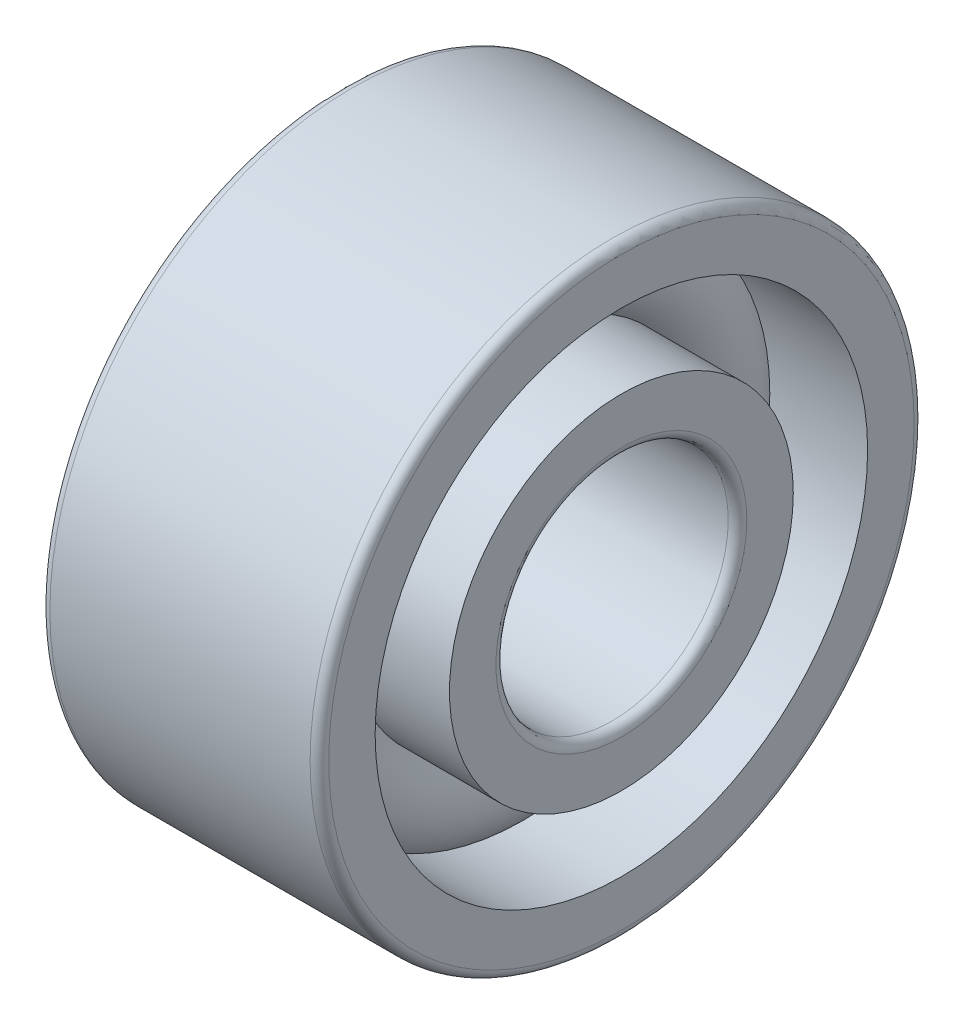
ISO-10303-21;
HEADER;
FILE_DESCRIPTION(('STEP AP214'),'2;1');
FILE_NAME('part.step','',(''),(''),'','','');
FILE_SCHEMA(('AUTOMOTIVE_DESIGN { 1 0 10303 214 1 1 1 1 }'));
ENDSEC;
DATA;
#1=APPLICATION_CONTEXT('core data for automotive mechanical design processes');
#2=APPLICATION_PROTOCOL_DEFINITION('international standard','automotive_design',2000,#1);
#3=PRODUCT_CONTEXT('',#1,'mechanical');
#4=PRODUCT('Part','Part','',(#3));
#5=PRODUCT_RELATED_PRODUCT_CATEGORY('part','',(#4));
#6=PRODUCT_DEFINITION_FORMATION('','',#4);
#7=PRODUCT_DEFINITION_CONTEXT('part definition',#1,'design');
#8=PRODUCT_DEFINITION('design','',#6,#7);
#9=PRODUCT_DEFINITION_SHAPE('','',#8);
#10=(LENGTH_UNIT() NAMED_UNIT(*) SI_UNIT(.MILLI.,.METRE.));
#11=(NAMED_UNIT(*) PLANE_ANGLE_UNIT() SI_UNIT($,.RADIAN.));
#12=(NAMED_UNIT(*) SI_UNIT($,.STERADIAN.) SOLID_ANGLE_UNIT());
#13=UNCERTAINTY_MEASURE_WITH_UNIT(LENGTH_MEASURE(1.E-05),#10,'distance_accuracy_value','');
#14=(GEOMETRIC_REPRESENTATION_CONTEXT(3) GLOBAL_UNCERTAINTY_ASSIGNED_CONTEXT((#13)) GLOBAL_UNIT_ASSIGNED_CONTEXT((#10,
#11,#12)) REPRESENTATION_CONTEXT('',''));
#15=CARTESIAN_POINT('',(0.,0.,0.));
#16=DIRECTION('',(0.,0.,1.));
#17=DIRECTION('',(1.,0.,0.));
#18=AXIS2_PLACEMENT_3D('',#15,#16,#17);
#19=CARTESIAN_POINT('',(0.,0.,0.));
#20=DIRECTION('',(-1.,0.,0.));
#21=DIRECTION('',(0.,0.,1.));
#22=AXIS2_PLACEMENT_3D('',#19,#20,#21);
#23=TOROIDAL_SURFACE('',#22,4.5,1.2);
#24=CARTESIAN_POINT('',(0.894427190999911,0.,0.));
#25=DIRECTION('',(-1.,0.,0.));
#26=DIRECTION('',(0.,0.,1.));
#27=AXIS2_PLACEMENT_3D('',#24,#25,#26);
#28=CIRCLE('',#27,5.30000000000001);
#29=CARTESIAN_POINT('',(0.894427190999911,0.,5.30000000000001));
#30=VERTEX_POINT('',#29);
#31=EDGE_CURVE('E35',#30,#30,#28,.F.);
#32=ORIENTED_EDGE('',*,*,#31,.T.);
#33=EDGE_LOOP('',(#32));
#34=FACE_BOUND('',#33,.T.);
#35=CARTESIAN_POINT('',(0.894427190999916,0.,0.));
#36=DIRECTION('',(-1.,0.,0.));
#37=DIRECTION('',(0.,0.,1.));
#38=AXIS2_PLACEMENT_3D('',#35,#36,#37);
#39=CIRCLE('',#38,3.7);
#40=CARTESIAN_POINT('',(0.894427190999916,0.,3.7));
#41=VERTEX_POINT('',#40);
#42=EDGE_CURVE('E10',#41,#41,#39,.T.);
#43=ORIENTED_EDGE('',*,*,#42,.T.);
#44=EDGE_LOOP('',(#43));
#45=FACE_BOUND('',#44,.T.);
#46=ADVANCED_FACE('F31',(#34,#45),#23,.T.);
#47=CARTESIAN_POINT('',(-20.6375,0.,0.));
#48=DIRECTION('',(1.,0.,0.));
#49=DIRECTION('',(0.,0.,-1.));
#50=AXIS2_PLACEMENT_3D('',#47,#48,#49);
#51=CYLINDRICAL_SURFACE('',#50,3.7);
#52=CARTESIAN_POINT('',(3.,0.,0.));
#53=DIRECTION('',(1.,0.,0.));
#54=DIRECTION('',(0.,0.,-1.));
#55=AXIS2_PLACEMENT_3D('',#52,#53,#54);
#56=CIRCLE('',#55,3.7);
#57=CARTESIAN_POINT('',(3.,0.,-3.7));
#58=VERTEX_POINT('',#57);
#59=EDGE_CURVE('E44',#58,#58,#56,.T.);
#60=ORIENTED_EDGE('',*,*,#59,.F.);
#61=EDGE_LOOP('',(#60));
#62=FACE_BOUND('',#61,.T.);
#63=ORIENTED_EDGE('',*,*,#42,.F.);
#64=EDGE_LOOP('',(#63));
#65=FACE_BOUND('',#64,.T.);
#66=ADVANCED_FACE('F83',(#62,#65),#51,.T.);
#67=CARTESIAN_POINT('',(-20.6375,0.,0.));
#68=DIRECTION('',(1.,0.,0.));
#69=DIRECTION('',(0.,0.,-1.));
#70=AXIS2_PLACEMENT_3D('',#67,#68,#69);
#71=CYLINDRICAL_SURFACE('',#70,3.7);
#72=CARTESIAN_POINT('',(-3.,0.,0.));
#73=DIRECTION('',(1.,0.,0.));
#74=DIRECTION('',(0.,0.,-1.));
#75=AXIS2_PLACEMENT_3D('',#72,#73,#74);
#76=CIRCLE('',#75,3.7);
#77=CARTESIAN_POINT('',(-3.,0.,-3.7));
#78=VERTEX_POINT('',#77);
#79=EDGE_CURVE('E53',#78,#78,#76,.T.);
#80=ORIENTED_EDGE('',*,*,#79,.T.);
#81=EDGE_LOOP('',(#80));
#82=FACE_BOUND('',#81,.T.);
#83=CARTESIAN_POINT('',(-0.894427190999916,0.,0.));
#84=DIRECTION('',(1.,0.,0.));
#85=DIRECTION('',(0.,0.,-1.));
#86=AXIS2_PLACEMENT_3D('',#83,#84,#85);
#87=CIRCLE('',#86,3.7);
#88=CARTESIAN_POINT('',(-0.894427190999916,0.,-3.7));
#89=VERTEX_POINT('',#88);
#90=EDGE_CURVE('E39',#89,#89,#87,.T.);
#91=ORIENTED_EDGE('',*,*,#90,.F.);
#92=EDGE_LOOP('',(#91));
#93=FACE_BOUND('',#92,.T.);
#94=ADVANCED_FACE('F86',(#82,#93),#71,.T.);
#95=CARTESIAN_POINT('',(3.,2.7,0.));
#96=DIRECTION('',(1.,0.,0.));
#97=DIRECTION('',(0.,0.,-1.));
#98=AXIS2_PLACEMENT_3D('',#95,#96,#97);
#99=PLANE('',#98);
#100=ORIENTED_EDGE('',*,*,#59,.T.);
#101=EDGE_LOOP('',(#100));
#102=FACE_BOUND('',#101,.T.);
#103=CARTESIAN_POINT('',(3.,0.,0.));
#104=DIRECTION('',(1.,0.,0.));
#105=DIRECTION('',(0.,0.,-1.));
#106=AXIS2_PLACEMENT_3D('',#103,#104,#105);
#107=CIRCLE('',#106,2.7);
#108=CARTESIAN_POINT('',(3.,0.,-2.7));
#109=VERTEX_POINT('',#108);
#110=EDGE_CURVE('E75',#109,#109,#107,.T.);
#111=ORIENTED_EDGE('',*,*,#110,.F.);
#112=EDGE_LOOP('',(#111));
#113=FACE_BOUND('',#112,.T.);
#114=ADVANCED_FACE('F80',(#102,#113),#99,.T.);
#115=CARTESIAN_POINT('',(2.8,0.,0.));
#116=DIRECTION('',(1.,0.,0.));
#117=DIRECTION('',(0.,0.,-1.));
#118=AXIS2_PLACEMENT_3D('',#115,#116,#117);
#119=TOROIDAL_SURFACE('',#118,2.7,0.200000000000001);
#120=ORIENTED_EDGE('',*,*,#110,.T.);
#121=EDGE_LOOP('',(#120));
#122=FACE_BOUND('',#121,.T.);
#123=CARTESIAN_POINT('',(2.8,0.,0.));
#124=DIRECTION('',(1.,0.,0.));
#125=DIRECTION('',(0.,0.,-1.));
#126=AXIS2_PLACEMENT_3D('',#123,#124,#125);
#127=CIRCLE('',#126,2.5);
#128=CARTESIAN_POINT('',(2.8,0.,-2.5));
#129=VERTEX_POINT('',#128);
#130=EDGE_CURVE('E72',#129,#129,#127,.T.);
#131=ORIENTED_EDGE('',*,*,#130,.F.);
#132=EDGE_LOOP('',(#131));
#133=FACE_BOUND('',#132,.T.);
#134=ADVANCED_FACE('F97',(#122,#133),#119,.T.);
#135=CARTESIAN_POINT('',(-20.6375,0.,0.));
#136=DIRECTION('',(1.,0.,0.));
#137=DIRECTION('',(0.,0.,-1.));
#138=AXIS2_PLACEMENT_3D('',#135,#136,#137);
#139=CYLINDRICAL_SURFACE('',#138,2.5);
#140=ORIENTED_EDGE('',*,*,#130,.T.);
#141=EDGE_LOOP('',(#140));
#142=FACE_BOUND('',#141,.T.);
#143=CARTESIAN_POINT('',(-2.8,0.,0.));
#144=DIRECTION('',(1.,0.,0.));
#145=DIRECTION('',(0.,0.,-1.));
#146=AXIS2_PLACEMENT_3D('',#143,#144,#145);
#147=CIRCLE('',#146,2.5);
#148=CARTESIAN_POINT('',(-2.8,0.,-2.5));
#149=VERTEX_POINT('',#148);
#150=EDGE_CURVE('E69',#149,#149,#147,.T.);
#151=ORIENTED_EDGE('',*,*,#150,.F.);
#152=EDGE_LOOP('',(#151));
#153=FACE_BOUND('',#152,.T.);
#154=ADVANCED_FACE('F100',(#142,#153),#139,.F.);
#155=CARTESIAN_POINT('',(-2.8,0.,0.));
#156=DIRECTION('',(1.,0.,0.));
#157=DIRECTION('',(0.,0.,-1.));
#158=AXIS2_PLACEMENT_3D('',#155,#156,#157);
#159=TOROIDAL_SURFACE('',#158,2.7,0.200000000000001);
#160=ORIENTED_EDGE('',*,*,#150,.T.);
#161=EDGE_LOOP('',(#160));
#162=FACE_BOUND('',#161,.T.);
#163=CARTESIAN_POINT('',(-3.,0.,0.));
#164=DIRECTION('',(1.,0.,0.));
#165=DIRECTION('',(0.,0.,-1.));
#166=AXIS2_PLACEMENT_3D('',#163,#164,#165);
#167=CIRCLE('',#166,2.7);
#168=CARTESIAN_POINT('',(-3.,0.,-2.7));
#169=VERTEX_POINT('',#168);
#170=EDGE_CURVE('E66',#169,#169,#167,.T.);
#171=ORIENTED_EDGE('',*,*,#170,.F.);
#172=EDGE_LOOP('',(#171));
#173=FACE_BOUND('',#172,.T.);
#174=ADVANCED_FACE('F104',(#162,#173),#159,.T.);
#175=CARTESIAN_POINT('',(-3.,3.7,0.));
#176=DIRECTION('',(-1.,0.,0.));
#177=DIRECTION('',(0.,0.,1.));
#178=AXIS2_PLACEMENT_3D('',#175,#176,#177);
#179=PLANE('',#178);
#180=ORIENTED_EDGE('',*,*,#170,.T.);
#181=EDGE_LOOP('',(#180));
#182=FACE_BOUND('',#181,.T.);
#183=ORIENTED_EDGE('',*,*,#79,.F.);
#184=EDGE_LOOP('',(#183));
#185=FACE_BOUND('',#184,.T.);
#186=ADVANCED_FACE('F108',(#182,#185),#179,.T.);
#187=CARTESIAN_POINT('',(-0.894427190999911,0.,0.));
#188=DIRECTION('',(1.,0.,0.));
#189=DIRECTION('',(0.,0.,-1.));
#190=AXIS2_PLACEMENT_3D('',#187,#188,#189);
#191=CIRCLE('',#190,5.30000000000001);
#192=CARTESIAN_POINT('',(-0.894427190999911,0.,-5.30000000000001));
#193=VERTEX_POINT('',#192);
#194=EDGE_CURVE('E47',#193,#193,#191,.F.);
#195=ORIENTED_EDGE('',*,*,#194,.T.);
#196=EDGE_LOOP('',(#195));
#197=FACE_BOUND('',#196,.T.);
#198=ORIENTED_EDGE('',*,*,#90,.T.);
#199=EDGE_LOOP('',(#198));
#200=FACE_BOUND('',#199,.T.);
#201=ADVANCED_FACE('F33',(#197,#200),#23,.T.);
#202=CARTESIAN_POINT('',(-20.6375,0.,0.));
#203=DIRECTION('',(1.,0.,0.));
#204=DIRECTION('',(0.,0.,-1.));
#205=AXIS2_PLACEMENT_3D('',#202,#203,#204);
#206=CYLINDRICAL_SURFACE('',#205,5.30000000000001);
#207=CARTESIAN_POINT('',(3.,0.,0.));
#208=DIRECTION('',(1.,0.,0.));
#209=DIRECTION('',(0.,0.,-1.));
#210=AXIS2_PLACEMENT_3D('',#207,#208,#209);
#211=CIRCLE('',#210,5.30000000000001);
#212=CARTESIAN_POINT('',(3.,0.,-5.30000000000001));
#213=VERTEX_POINT('',#212);
#214=EDGE_CURVE('E49',#213,#213,#211,.T.);
#215=ORIENTED_EDGE('',*,*,#214,.T.);
#216=EDGE_LOOP('',(#215));
#217=FACE_BOUND('',#216,.T.);
#218=ORIENTED_EDGE('',*,*,#31,.F.);
#219=EDGE_LOOP('',(#218));
#220=FACE_BOUND('',#219,.T.);
#221=ADVANCED_FACE('F113',(#217,#220),#206,.F.);
#222=CARTESIAN_POINT('',(-20.6375,0.,0.));
#223=DIRECTION('',(1.,0.,0.));
#224=DIRECTION('',(0.,0.,-1.));
#225=AXIS2_PLACEMENT_3D('',#222,#223,#224);
#226=CYLINDRICAL_SURFACE('',#225,5.30000000000001);
#227=CARTESIAN_POINT('',(-3.,0.,0.));
#228=DIRECTION('',(1.,0.,0.));
#229=DIRECTION('',(0.,0.,-1.));
#230=AXIS2_PLACEMENT_3D('',#227,#228,#229);
#231=CIRCLE('',#230,5.30000000000001);
#232=CARTESIAN_POINT('',(-3.,0.,-5.30000000000001));
#233=VERTEX_POINT('',#232);
#234=EDGE_CURVE('E144',#233,#233,#231,.T.);
#235=ORIENTED_EDGE('',*,*,#234,.F.);
#236=EDGE_LOOP('',(#235));
#237=FACE_BOUND('',#236,.T.);
#238=ORIENTED_EDGE('',*,*,#194,.F.);
#239=EDGE_LOOP('',(#238));
#240=FACE_BOUND('',#239,.T.);
#241=ADVANCED_FACE('F116',(#237,#240),#226,.F.);
#242=CARTESIAN_POINT('',(3.,6.3,0.));
#243=DIRECTION('',(1.,0.,0.));
#244=DIRECTION('',(0.,0.,-1.));
#245=AXIS2_PLACEMENT_3D('',#242,#243,#244);
#246=PLANE('',#245);
#247=CARTESIAN_POINT('',(3.,0.,0.));
#248=DIRECTION('',(1.,0.,0.));
#249=DIRECTION('',(0.,0.,-1.));
#250=AXIS2_PLACEMENT_3D('',#247,#248,#249);
#251=CIRCLE('',#250,6.3);
#252=CARTESIAN_POINT('',(3.,0.,-6.3));
#253=VERTEX_POINT('',#252);
#254=EDGE_CURVE('E55',#253,#253,#251,.T.);
#255=ORIENTED_EDGE('',*,*,#254,.T.);
#256=EDGE_LOOP('',(#255));
#257=FACE_BOUND('',#256,.T.);
#258=ORIENTED_EDGE('',*,*,#214,.F.);
#259=EDGE_LOOP('',(#258));
#260=FACE_BOUND('',#259,.T.);
#261=ADVANCED_FACE('F117',(#257,#260),#246,.T.);
#262=CARTESIAN_POINT('',(2.8,0.,0.));
#263=DIRECTION('',(1.,0.,0.));
#264=DIRECTION('',(0.,0.,-1.));
#265=AXIS2_PLACEMENT_3D('',#262,#263,#264);
#266=TOROIDAL_SURFACE('',#265,6.3,0.2);
#267=CARTESIAN_POINT('',(2.8,0.,0.));
#268=DIRECTION('',(1.,0.,0.));
#269=DIRECTION('',(0.,0.,-1.));
#270=AXIS2_PLACEMENT_3D('',#267,#268,#269);
#271=CIRCLE('',#270,6.5);
#272=CARTESIAN_POINT('',(2.8,0.,-6.5));
#273=VERTEX_POINT('',#272);
#274=EDGE_CURVE('E60',#273,#273,#271,.T.);
#275=ORIENTED_EDGE('',*,*,#274,.T.);
#276=EDGE_LOOP('',(#275));
#277=FACE_BOUND('',#276,.T.);
#278=ORIENTED_EDGE('',*,*,#254,.F.);
#279=EDGE_LOOP('',(#278));
#280=FACE_BOUND('',#279,.T.);
#281=ADVANCED_FACE('F120',(#277,#280),#266,.T.);
#282=CARTESIAN_POINT('',(-20.6375,0.,0.));
#283=DIRECTION('',(1.,0.,0.));
#284=DIRECTION('',(0.,0.,-1.));
#285=AXIS2_PLACEMENT_3D('',#282,#283,#284);
#286=CYLINDRICAL_SURFACE('',#285,6.5);
#287=CARTESIAN_POINT('',(-2.8,0.,0.));
#288=DIRECTION('',(1.,0.,0.));
#289=DIRECTION('',(0.,0.,-1.));
#290=AXIS2_PLACEMENT_3D('',#287,#288,#289);
#291=CIRCLE('',#290,6.5);
#292=CARTESIAN_POINT('',(-2.8,0.,-6.5));
#293=VERTEX_POINT('',#292);
#294=EDGE_CURVE('E148',#293,#293,#291,.T.);
#295=ORIENTED_EDGE('',*,*,#294,.T.);
#296=EDGE_LOOP('',(#295));
#297=FACE_BOUND('',#296,.T.);
#298=ORIENTED_EDGE('',*,*,#274,.F.);
#299=EDGE_LOOP('',(#298));
#300=FACE_BOUND('',#299,.T.);
#301=ADVANCED_FACE('F124',(#297,#300),#286,.T.);
#302=CARTESIAN_POINT('',(-2.8,0.,0.));
#303=DIRECTION('',(1.,0.,0.));
#304=DIRECTION('',(0.,0.,-1.));
#305=AXIS2_PLACEMENT_3D('',#302,#303,#304);
#306=TOROIDAL_SURFACE('',#305,6.3,0.2);
#307=CARTESIAN_POINT('',(-3.,0.,0.));
#308=DIRECTION('',(1.,0.,0.));
#309=DIRECTION('',(0.,0.,-1.));
#310=AXIS2_PLACEMENT_3D('',#307,#308,#309);
#311=CIRCLE('',#310,6.3);
#312=CARTESIAN_POINT('',(-3.,0.,-6.3));
#313=VERTEX_POINT('',#312);
#314=EDGE_CURVE('E145',#313,#313,#311,.T.);
#315=ORIENTED_EDGE('',*,*,#314,.T.);
#316=EDGE_LOOP('',(#315));
#317=FACE_BOUND('',#316,.T.);
#318=ORIENTED_EDGE('',*,*,#294,.F.);
#319=EDGE_LOOP('',(#318));
#320=FACE_BOUND('',#319,.T.);
#321=ADVANCED_FACE('F128',(#317,#320),#306,.T.);
#322=CARTESIAN_POINT('',(-3.,5.30000000000001,0.));
#323=DIRECTION('',(-1.,0.,0.));
#324=DIRECTION('',(0.,0.,1.));
#325=AXIS2_PLACEMENT_3D('',#322,#323,#324);
#326=PLANE('',#325);
#327=ORIENTED_EDGE('',*,*,#234,.T.);
#328=EDGE_LOOP('',(#327));
#329=FACE_BOUND('',#328,.T.);
#330=ORIENTED_EDGE('',*,*,#314,.F.);
#331=EDGE_LOOP('',(#330));
#332=FACE_BOUND('',#331,.T.);
#333=ADVANCED_FACE('F132',(#329,#332),#326,.T.);
#334=CLOSED_SHELL('',(#46,#66,#94,#114,#134,#154,#174,#186,#201,#221,#241,#261,#281,#301,#321,#333));
#335=MANIFOLD_SOLID_BREP('B2',#334);
#336=ADVANCED_BREP_SHAPE_REPRESENTATION('',(#18,#335),#14);
#337=SHAPE_DEFINITION_REPRESENTATION(#9,#336);
ENDSEC;
END-ISO-10303-21;
